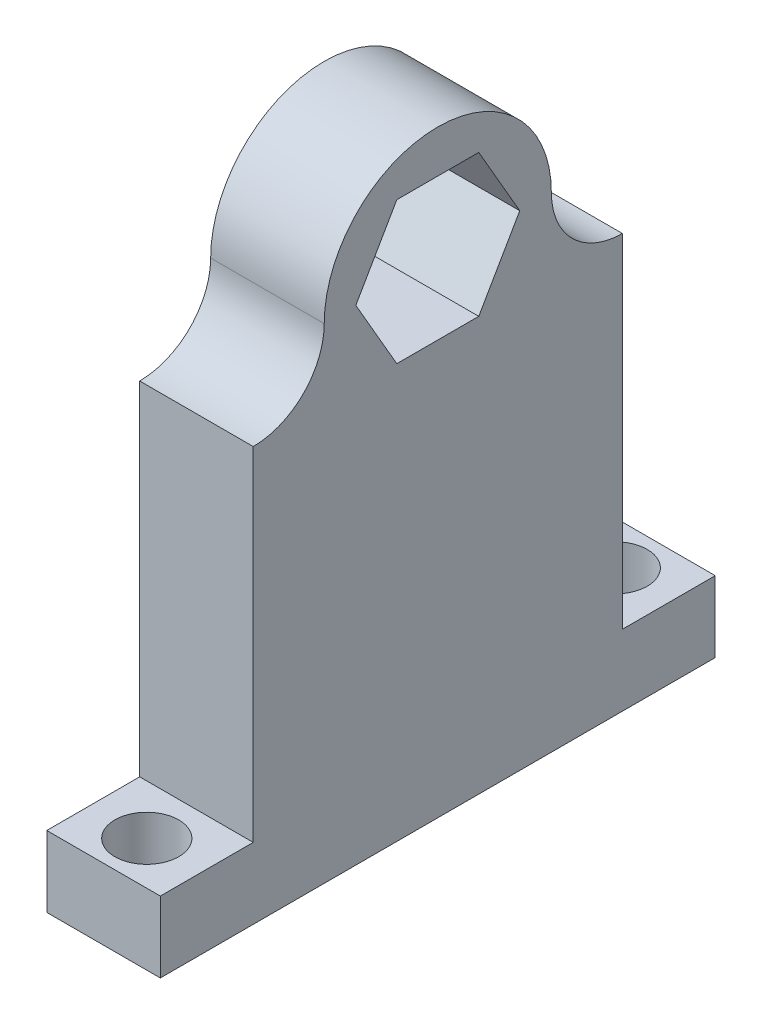
ISO-10303-21;
HEADER;
FILE_DESCRIPTION(('STEP AP214'),'2;1');
FILE_NAME('part.step','',(''),(''),'','','');
FILE_SCHEMA(('AUTOMOTIVE_DESIGN { 1 0 10303 214 1 1 1 1 }'));
ENDSEC;
DATA;
#1=APPLICATION_CONTEXT('core data for automotive mechanical design processes');
#2=APPLICATION_PROTOCOL_DEFINITION('international standard','automotive_design',2000,#1);
#3=PRODUCT_CONTEXT('',#1,'mechanical');
#4=PRODUCT('Part','Part','',(#3));
#5=PRODUCT_RELATED_PRODUCT_CATEGORY('part','',(#4));
#6=PRODUCT_DEFINITION_FORMATION('','',#4);
#7=PRODUCT_DEFINITION_CONTEXT('part definition',#1,'design');
#8=PRODUCT_DEFINITION('design','',#6,#7);
#9=PRODUCT_DEFINITION_SHAPE('','',#8);
#10=(LENGTH_UNIT() NAMED_UNIT(*) SI_UNIT(.MILLI.,.METRE.));
#11=(NAMED_UNIT(*) PLANE_ANGLE_UNIT() SI_UNIT($,.RADIAN.));
#12=(NAMED_UNIT(*) SI_UNIT($,.STERADIAN.) SOLID_ANGLE_UNIT());
#13=UNCERTAINTY_MEASURE_WITH_UNIT(LENGTH_MEASURE(1.E-05),#10,'distance_accuracy_value','');
#14=(GEOMETRIC_REPRESENTATION_CONTEXT(3) GLOBAL_UNCERTAINTY_ASSIGNED_CONTEXT((#13)) GLOBAL_UNIT_ASSIGNED_CONTEXT((#10,
#11,#12)) REPRESENTATION_CONTEXT('',''));
#15=CARTESIAN_POINT('',(0.,0.,0.));
#16=DIRECTION('',(0.,0.,1.));
#17=DIRECTION('',(1.,0.,0.));
#18=AXIS2_PLACEMENT_3D('',#15,#16,#17);
#19=CARTESIAN_POINT('',(8.,-5.,13.));
#20=DIRECTION('',(0.,0.,-1.));
#21=DIRECTION('',(0.,1.,0.));
#22=AXIS2_PLACEMENT_3D('',#19,#20,#21);
#23=PLANE('',#22);
#24=DIRECTION('',(-1.,0.,0.));
#25=VECTOR('',#24,1.);
#26=CARTESIAN_POINT('',(8.,-29.1500000000001,13.));
#27=LINE('',#26,#25);
#28=CARTESIAN_POINT('',(8.,-29.1500000000001,13.));
#29=VERTEX_POINT('',#28);
#30=CARTESIAN_POINT('',(0.,-29.1500000000001,13.));
#31=VERTEX_POINT('',#30);
#32=EDGE_CURVE('E62',#29,#31,#27,.T.);
#33=ORIENTED_EDGE('',*,*,#32,.F.);
#34=DIRECTION('',(0.,-1.,0.));
#35=VECTOR('',#34,1.);
#36=CARTESIAN_POINT('',(8.,-5.,13.));
#37=LINE('',#36,#35);
#38=CARTESIAN_POINT('',(8.,-5.00000000000003,13.));
#39=VERTEX_POINT('',#38);
#40=EDGE_CURVE('E263',#39,#29,#37,.T.);
#41=ORIENTED_EDGE('',*,*,#40,.F.);
#42=DIRECTION('',(-1.,0.,0.));
#43=VECTOR('',#42,1.);
#44=CARTESIAN_POINT('',(8.,-5.00000000000003,13.));
#45=LINE('',#44,#43);
#46=CARTESIAN_POINT('',(0.,-5.00000000000003,13.));
#47=VERTEX_POINT('',#46);
#48=EDGE_CURVE('E278',#39,#47,#45,.T.);
#49=ORIENTED_EDGE('',*,*,#48,.T.);
#50=DIRECTION('',(0.,-1.,0.));
#51=VECTOR('',#50,1.);
#52=CARTESIAN_POINT('',(0.,-5.,13.));
#53=LINE('',#52,#51);
#54=EDGE_CURVE('E273',#47,#31,#53,.T.);
#55=ORIENTED_EDGE('',*,*,#54,.T.);
#56=EDGE_LOOP('',(#33,#41,#49,#55));
#57=FACE_BOUND('',#56,.T.);
#58=ADVANCED_FACE('F39',(#57),#23,.F.);
#59=CARTESIAN_POINT('',(8.,-5.,-13.));
#60=DIRECTION('',(0.,0.,1.));
#61=DIRECTION('',(0.,-1.,0.));
#62=AXIS2_PLACEMENT_3D('',#59,#60,#61);
#63=PLANE('',#62);
#64=DIRECTION('',(1.,0.,0.));
#65=VECTOR('',#64,1.);
#66=CARTESIAN_POINT('',(8.,-29.15,-13.));
#67=LINE('',#66,#65);
#68=CARTESIAN_POINT('',(0.,-29.1500000000001,-13.));
#69=VERTEX_POINT('',#68);
#70=CARTESIAN_POINT('',(8.,-29.1500000000001,-13.));
#71=VERTEX_POINT('',#70);
#72=EDGE_CURVE('E196',#69,#71,#67,.T.);
#73=ORIENTED_EDGE('',*,*,#72,.F.);
#74=DIRECTION('',(0.,1.,0.));
#75=VECTOR('',#74,1.);
#76=CARTESIAN_POINT('',(0.,-5.,-13.));
#77=LINE('',#76,#75);
#78=CARTESIAN_POINT('',(0.,-5.,-13.));
#79=VERTEX_POINT('',#78);
#80=EDGE_CURVE('E161',#69,#79,#77,.T.);
#81=ORIENTED_EDGE('',*,*,#80,.T.);
#82=DIRECTION('',(-1.,0.,0.));
#83=VECTOR('',#82,1.);
#84=CARTESIAN_POINT('',(8.,-5.,-13.));
#85=LINE('',#84,#83);
#86=CARTESIAN_POINT('',(8.,-5.,-13.));
#87=VERTEX_POINT('',#86);
#88=EDGE_CURVE('E266',#87,#79,#85,.T.);
#89=ORIENTED_EDGE('',*,*,#88,.F.);
#90=DIRECTION('',(0.,1.,0.));
#91=VECTOR('',#90,1.);
#92=CARTESIAN_POINT('',(8.,-5.,-13.));
#93=LINE('',#92,#91);
#94=EDGE_CURVE('E54',#71,#87,#93,.T.);
#95=ORIENTED_EDGE('',*,*,#94,.F.);
#96=EDGE_LOOP('',(#73,#81,#89,#95));
#97=FACE_BOUND('',#96,.T.);
#98=ADVANCED_FACE('F306',(#97),#63,.F.);
#99=CARTESIAN_POINT('',(8.,0.,-13.));
#100=DIRECTION('',(-1.,0.,0.));
#101=DIRECTION('',(0.,0.,1.));
#102=AXIS2_PLACEMENT_3D('',#99,#100,#101);
#103=CYLINDRICAL_SURFACE('',#102,5.);
#104=CARTESIAN_POINT('',(0.,0.,-13.));
#105=DIRECTION('',(-1.,0.,0.));
#106=DIRECTION('',(0.,0.,-1.));
#107=AXIS2_PLACEMENT_3D('',#104,#105,#106);
#108=CIRCLE('',#107,5.);
#109=CARTESIAN_POINT('',(0.,0.,-8.));
#110=VERTEX_POINT('',#109);
#111=EDGE_CURVE('E245',#79,#110,#108,.T.);
#112=ORIENTED_EDGE('',*,*,#111,.T.);
#113=DIRECTION('',(-1.,0.,0.));
#114=VECTOR('',#113,1.);
#115=CARTESIAN_POINT('',(8.,0.,-8.));
#116=LINE('',#115,#114);
#117=CARTESIAN_POINT('',(8.,0.,-8.));
#118=VERTEX_POINT('',#117);
#119=EDGE_CURVE('E11',#118,#110,#116,.T.);
#120=ORIENTED_EDGE('',*,*,#119,.F.);
#121=CARTESIAN_POINT('',(8.,0.,-13.));
#122=DIRECTION('',(-1.,0.,0.));
#123=DIRECTION('',(0.,0.,-1.));
#124=AXIS2_PLACEMENT_3D('',#121,#122,#123);
#125=CIRCLE('',#124,5.);
#126=EDGE_CURVE('E256',#87,#118,#125,.T.);
#127=ORIENTED_EDGE('',*,*,#126,.F.);
#128=ORIENTED_EDGE('',*,*,#88,.T.);
#129=EDGE_LOOP('',(#112,#120,#127,#128));
#130=FACE_BOUND('',#129,.T.);
#131=ADVANCED_FACE('F41',(#130),#103,.F.);
#132=CARTESIAN_POINT('',(8.,0.,0.));
#133=DIRECTION('',(-1.,0.,0.));
#134=DIRECTION('',(0.,0.,1.));
#135=AXIS2_PLACEMENT_3D('',#132,#133,#134);
#136=CYLINDRICAL_SURFACE('',#135,8.);
#137=CARTESIAN_POINT('',(0.,0.,0.));
#138=DIRECTION('',(1.,0.,0.));
#139=DIRECTION('',(0.,0.,-1.));
#140=AXIS2_PLACEMENT_3D('',#137,#138,#139);
#141=CIRCLE('',#140,8.);
#142=CARTESIAN_POINT('',(0.,0.,8.));
#143=VERTEX_POINT('',#142);
#144=EDGE_CURVE('E269',#110,#143,#141,.T.);
#145=ORIENTED_EDGE('',*,*,#144,.T.);
#146=DIRECTION('',(-1.,0.,0.));
#147=VECTOR('',#146,1.);
#148=CARTESIAN_POINT('',(8.,0.,8.));
#149=LINE('',#148,#147);
#150=CARTESIAN_POINT('',(8.,0.,8.));
#151=VERTEX_POINT('',#150);
#152=EDGE_CURVE('E47',#151,#143,#149,.T.);
#153=ORIENTED_EDGE('',*,*,#152,.F.);
#154=CARTESIAN_POINT('',(8.,0.,0.));
#155=DIRECTION('',(1.,0.,0.));
#156=DIRECTION('',(0.,0.,-1.));
#157=AXIS2_PLACEMENT_3D('',#154,#155,#156);
#158=CIRCLE('',#157,8.);
#159=EDGE_CURVE('E259',#118,#151,#158,.T.);
#160=ORIENTED_EDGE('',*,*,#159,.F.);
#161=ORIENTED_EDGE('',*,*,#119,.T.);
#162=EDGE_LOOP('',(#145,#153,#160,#161));
#163=FACE_BOUND('',#162,.T.);
#164=ADVANCED_FACE('F308',(#163),#136,.T.);
#165=CARTESIAN_POINT('',(8.,0.,13.0000000000001));
#166=DIRECTION('',(-1.,0.,0.));
#167=DIRECTION('',(0.,0.,1.));
#168=AXIS2_PLACEMENT_3D('',#165,#166,#167);
#169=CYLINDRICAL_SURFACE('',#168,5.00000000000003);
#170=CARTESIAN_POINT('',(0.,0.,13.0000000000001));
#171=DIRECTION('',(-1.,0.,0.));
#172=DIRECTION('',(0.,0.,-1.));
#173=AXIS2_PLACEMENT_3D('',#170,#171,#172);
#174=CIRCLE('',#173,5.00000000000003);
#175=EDGE_CURVE('E271',#143,#47,#174,.T.);
#176=ORIENTED_EDGE('',*,*,#175,.T.);
#177=ORIENTED_EDGE('',*,*,#48,.F.);
#178=CARTESIAN_POINT('',(8.,0.,13.0000000000001));
#179=DIRECTION('',(-1.,0.,0.));
#180=DIRECTION('',(0.,0.,-1.));
#181=AXIS2_PLACEMENT_3D('',#178,#179,#180);
#182=CIRCLE('',#181,5.00000000000003);
#183=EDGE_CURVE('E261',#151,#39,#182,.T.);
#184=ORIENTED_EDGE('',*,*,#183,.F.);
#185=ORIENTED_EDGE('',*,*,#152,.T.);
#186=EDGE_LOOP('',(#176,#177,#184,#185));
#187=FACE_BOUND('',#186,.T.);
#188=ADVANCED_FACE('F285',(#187),#169,.F.);
#189=CARTESIAN_POINT('',(8.,0.,-13.));
#190=DIRECTION('',(1.,0.,0.));
#191=DIRECTION('',(0.,0.,-1.));
#192=AXIS2_PLACEMENT_3D('',#189,#190,#191);
#193=PLANE('',#192);
#194=DIRECTION('',(0.,0.,-1.));
#195=VECTOR('',#194,1.);
#196=CARTESIAN_POINT('',(8.,-34.1500000000001,-13.));
#197=LINE('',#196,#195);
#198=CARTESIAN_POINT('',(7.99999999999996,-34.1500000000001,19.5454545454058));
#199=VERTEX_POINT('',#198);
#200=CARTESIAN_POINT('',(7.99999999999996,-34.15,-19.5454545455033));
#201=VERTEX_POINT('',#200);
#202=EDGE_CURVE('E203',#199,#201,#197,.T.);
#203=ORIENTED_EDGE('',*,*,#202,.T.);
#204=DIRECTION('',(0.,-1.,0.));
#205=VECTOR('',#204,1.);
#206=CARTESIAN_POINT('',(7.99999999999996,-29.15,-19.5454545455033));
#207=LINE('',#206,#205);
#208=CARTESIAN_POINT('',(7.99999999999996,-29.15,-19.5454545455033));
#209=VERTEX_POINT('',#208);
#210=EDGE_CURVE('E174',#209,#201,#207,.T.);
#211=ORIENTED_EDGE('',*,*,#210,.F.);
#212=DIRECTION('',(0.,0.,1.));
#213=VECTOR('',#212,1.);
#214=CARTESIAN_POINT('',(7.99999999999996,-29.1500000000001,19.5454545454058));
#215=LINE('',#214,#213);
#216=EDGE_CURVE('E180',#209,#71,#215,.T.);
#217=ORIENTED_EDGE('',*,*,#216,.T.);
#218=ORIENTED_EDGE('',*,*,#94,.T.);
#219=ORIENTED_EDGE('',*,*,#126,.T.);
#220=ORIENTED_EDGE('',*,*,#159,.T.);
#221=ORIENTED_EDGE('',*,*,#183,.T.);
#222=ORIENTED_EDGE('',*,*,#40,.T.);
#223=CARTESIAN_POINT('',(7.99999999999996,-29.1500000000001,19.5454545454058));
#224=VERTEX_POINT('',#223);
#225=EDGE_CURVE('E181',#29,#224,#215,.T.);
#226=ORIENTED_EDGE('',*,*,#225,.T.);
#227=DIRECTION('',(0.,-1.,0.));
#228=VECTOR('',#227,1.);
#229=CARTESIAN_POINT('',(7.99999999999996,-29.1500000000001,19.5454545454058));
#230=LINE('',#229,#228);
#231=EDGE_CURVE('E197',#224,#199,#230,.T.);
#232=ORIENTED_EDGE('',*,*,#231,.T.);
#233=EDGE_LOOP('',(#203,#211,#217,#218,#219,#220,#221,#222,#226,#232));
#234=FACE_BOUND('',#233,.T.);
#235=DIRECTION('',(0.,0.866025403784439,-0.5));
#236=VECTOR('',#235,1.);
#237=CARTESIAN_POINT('',(8.,-5.,-2.88675134594813));
#238=LINE('',#237,#236);
#239=CARTESIAN_POINT('',(8.,-5.,-2.88675134594813));
#240=VERTEX_POINT('',#239);
#241=CARTESIAN_POINT('',(8.,0.,-5.77350269189626));
#242=VERTEX_POINT('',#241);
#243=EDGE_CURVE('E206',#240,#242,#238,.T.);
#244=ORIENTED_EDGE('',*,*,#243,.F.);
#245=DIRECTION('',(0.,0.,-1.));
#246=VECTOR('',#245,1.);
#247=CARTESIAN_POINT('',(8.,-5.,2.88675134594813));
#248=LINE('',#247,#246);
#249=CARTESIAN_POINT('',(8.,-5.,2.88675134594813));
#250=VERTEX_POINT('',#249);
#251=EDGE_CURVE('E212',#250,#240,#248,.T.);
#252=ORIENTED_EDGE('',*,*,#251,.F.);
#253=DIRECTION('',(0.,-0.866025403784439,-0.5));
#254=VECTOR('',#253,1.);
#255=CARTESIAN_POINT('',(8.,0.,5.77350269189626));
#256=LINE('',#255,#254);
#257=CARTESIAN_POINT('',(8.,0.,5.77350269189626));
#258=VERTEX_POINT('',#257);
#259=EDGE_CURVE('E238',#258,#250,#256,.T.);
#260=ORIENTED_EDGE('',*,*,#259,.F.);
#261=DIRECTION('',(0.,-0.866025403784439,0.5));
#262=VECTOR('',#261,1.);
#263=CARTESIAN_POINT('',(8.,5.,2.88675134594813));
#264=LINE('',#263,#262);
#265=CARTESIAN_POINT('',(8.,5.,2.88675134594813));
#266=VERTEX_POINT('',#265);
#267=EDGE_CURVE('E235',#266,#258,#264,.T.);
#268=ORIENTED_EDGE('',*,*,#267,.F.);
#269=DIRECTION('',(0.,0.,1.));
#270=VECTOR('',#269,1.);
#271=CARTESIAN_POINT('',(8.,5.,-2.88675134594813));
#272=LINE('',#271,#270);
#273=CARTESIAN_POINT('',(8.,5.,-2.88675134594813));
#274=VERTEX_POINT('',#273);
#275=EDGE_CURVE('E232',#274,#266,#272,.T.);
#276=ORIENTED_EDGE('',*,*,#275,.F.);
#277=DIRECTION('',(0.,0.866025403784439,0.5));
#278=VECTOR('',#277,1.);
#279=CARTESIAN_POINT('',(8.,0.,-5.77350269189626));
#280=LINE('',#279,#278);
#281=EDGE_CURVE('E229',#242,#274,#280,.T.);
#282=ORIENTED_EDGE('',*,*,#281,.F.);
#283=EDGE_LOOP('',(#244,#252,#260,#268,#276,#282));
#284=FACE_BOUND('',#283,.T.);
#285=ADVANCED_FACE('F296',(#234,#284),#193,.T.);
#286=CARTESIAN_POINT('',(0.,0.,-13.));
#287=DIRECTION('',(1.,0.,0.));
#288=DIRECTION('',(0.,0.,-1.));
#289=AXIS2_PLACEMENT_3D('',#286,#287,#288);
#290=PLANE('',#289);
#291=DIRECTION('',(0.,0.,1.));
#292=VECTOR('',#291,1.);
#293=CARTESIAN_POINT('',(0.,-34.15,13.));
#294=LINE('',#293,#292);
#295=CARTESIAN_POINT('',(0.,-34.15,-19.5454545455033));
#296=VERTEX_POINT('',#295);
#297=CARTESIAN_POINT('',(0.,-34.1500000000001,19.5454545454058));
#298=VERTEX_POINT('',#297);
#299=EDGE_CURVE('E204',#296,#298,#294,.T.);
#300=ORIENTED_EDGE('',*,*,#299,.T.);
#301=DIRECTION('',(0.,-1.,0.));
#302=VECTOR('',#301,1.);
#303=CARTESIAN_POINT('',(0.,-29.1500000000001,19.5454545454058));
#304=LINE('',#303,#302);
#305=CARTESIAN_POINT('',(0.,-29.1500000000001,19.5454545454058));
#306=VERTEX_POINT('',#305);
#307=EDGE_CURVE('E193',#306,#298,#304,.T.);
#308=ORIENTED_EDGE('',*,*,#307,.F.);
#309=DIRECTION('',(0.,0.,-1.));
#310=VECTOR('',#309,1.);
#311=CARTESIAN_POINT('',(0.,-29.1500000000001,19.5454545454058));
#312=LINE('',#311,#310);
#313=EDGE_CURVE('E164',#306,#31,#312,.T.);
#314=ORIENTED_EDGE('',*,*,#313,.T.);
#315=ORIENTED_EDGE('',*,*,#54,.F.);
#316=ORIENTED_EDGE('',*,*,#175,.F.);
#317=ORIENTED_EDGE('',*,*,#144,.F.);
#318=ORIENTED_EDGE('',*,*,#111,.F.);
#319=ORIENTED_EDGE('',*,*,#80,.F.);
#320=CARTESIAN_POINT('',(0.,-29.15,-19.5454545455033));
#321=VERTEX_POINT('',#320);
#322=EDGE_CURVE('E154',#69,#321,#312,.T.);
#323=ORIENTED_EDGE('',*,*,#322,.T.);
#324=DIRECTION('',(0.,-1.,0.));
#325=VECTOR('',#324,1.);
#326=CARTESIAN_POINT('',(0.,-29.15,-19.5454545455033));
#327=LINE('',#326,#325);
#328=EDGE_CURVE('E158',#321,#296,#327,.T.);
#329=ORIENTED_EDGE('',*,*,#328,.T.);
#330=EDGE_LOOP('',(#300,#308,#314,#315,#316,#317,#318,#319,#323,#329));
#331=FACE_BOUND('',#330,.T.);
#332=DIRECTION('',(0.,0.,-1.));
#333=VECTOR('',#332,1.);
#334=CARTESIAN_POINT('',(0.,-5.,2.88675134594813));
#335=LINE('',#334,#333);
#336=CARTESIAN_POINT('',(0.,-5.,2.88675134594813));
#337=VERTEX_POINT('',#336);
#338=CARTESIAN_POINT('',(0.,-5.,-2.88675134594813));
#339=VERTEX_POINT('',#338);
#340=EDGE_CURVE('E224',#337,#339,#335,.T.);
#341=ORIENTED_EDGE('',*,*,#340,.T.);
#342=DIRECTION('',(0.,0.866025403784439,-0.5));
#343=VECTOR('',#342,1.);
#344=CARTESIAN_POINT('',(0.,-5.,-2.88675134594813));
#345=LINE('',#344,#343);
#346=CARTESIAN_POINT('',(0.,0.,-5.77350269189626));
#347=VERTEX_POINT('',#346);
#348=EDGE_CURVE('E208',#339,#347,#345,.T.);
#349=ORIENTED_EDGE('',*,*,#348,.T.);
#350=DIRECTION('',(0.,0.866025403784439,0.5));
#351=VECTOR('',#350,1.);
#352=CARTESIAN_POINT('',(0.,0.,-5.77350269189626));
#353=LINE('',#352,#351);
#354=CARTESIAN_POINT('',(0.,5.,-2.88675134594813));
#355=VERTEX_POINT('',#354);
#356=EDGE_CURVE('E211',#347,#355,#353,.T.);
#357=ORIENTED_EDGE('',*,*,#356,.T.);
#358=DIRECTION('',(0.,0.,1.));
#359=VECTOR('',#358,1.);
#360=CARTESIAN_POINT('',(0.,5.,-2.88675134594813));
#361=LINE('',#360,#359);
#362=CARTESIAN_POINT('',(0.,5.,2.88675134594813));
#363=VERTEX_POINT('',#362);
#364=EDGE_CURVE('E215',#355,#363,#361,.T.);
#365=ORIENTED_EDGE('',*,*,#364,.T.);
#366=DIRECTION('',(0.,-0.866025403784439,0.5));
#367=VECTOR('',#366,1.);
#368=CARTESIAN_POINT('',(0.,5.,2.88675134594813));
#369=LINE('',#368,#367);
#370=CARTESIAN_POINT('',(0.,0.,5.77350269189626));
#371=VERTEX_POINT('',#370);
#372=EDGE_CURVE('E218',#363,#371,#369,.T.);
#373=ORIENTED_EDGE('',*,*,#372,.T.);
#374=DIRECTION('',(0.,-0.866025403784439,-0.5));
#375=VECTOR('',#374,1.);
#376=CARTESIAN_POINT('',(0.,0.,5.77350269189626));
#377=LINE('',#376,#375);
#378=EDGE_CURVE('E221',#371,#337,#377,.T.);
#379=ORIENTED_EDGE('',*,*,#378,.T.);
#380=EDGE_LOOP('',(#341,#349,#357,#365,#373,#379));
#381=FACE_BOUND('',#380,.T.);
#382=ADVANCED_FACE('F156',(#331,#381),#290,.F.);
#383=CARTESIAN_POINT('',(0.,-5.,-2.88675134594813));
#384=DIRECTION('',(0.,-0.5,-0.866025403784439));
#385=DIRECTION('',(0.,0.866025403784439,-0.5));
#386=AXIS2_PLACEMENT_3D('',#383,#384,#385);
#387=PLANE('',#386);
#388=ORIENTED_EDGE('',*,*,#243,.T.);
#389=DIRECTION('',(1.,0.,0.));
#390=VECTOR('',#389,1.);
#391=CARTESIAN_POINT('',(0.,0.,-5.77350269189626));
#392=LINE('',#391,#390);
#393=EDGE_CURVE('E227',#347,#242,#392,.T.);
#394=ORIENTED_EDGE('',*,*,#393,.F.);
#395=ORIENTED_EDGE('',*,*,#348,.F.);
#396=DIRECTION('',(1.,0.,0.));
#397=VECTOR('',#396,1.);
#398=CARTESIAN_POINT('',(0.,-5.,-2.88675134594813));
#399=LINE('',#398,#397);
#400=EDGE_CURVE('E243',#339,#240,#399,.T.);
#401=ORIENTED_EDGE('',*,*,#400,.T.);
#402=EDGE_LOOP('',(#388,#394,#395,#401));
#403=FACE_BOUND('',#402,.T.);
#404=ADVANCED_FACE('F325',(#403),#387,.F.);
#405=CARTESIAN_POINT('',(0.,-5.,2.88675134594813));
#406=DIRECTION('',(0.,-1.,0.));
#407=DIRECTION('',(0.,0.,-1.));
#408=AXIS2_PLACEMENT_3D('',#405,#406,#407);
#409=PLANE('',#408);
#410=ORIENTED_EDGE('',*,*,#251,.T.);
#411=ORIENTED_EDGE('',*,*,#400,.F.);
#412=ORIENTED_EDGE('',*,*,#340,.F.);
#413=DIRECTION('',(1.,0.,0.));
#414=VECTOR('',#413,1.);
#415=CARTESIAN_POINT('',(0.,-5.,2.88675134594813));
#416=LINE('',#415,#414);
#417=EDGE_CURVE('E246',#337,#250,#416,.T.);
#418=ORIENTED_EDGE('',*,*,#417,.T.);
#419=EDGE_LOOP('',(#410,#411,#412,#418));
#420=FACE_BOUND('',#419,.T.);
#421=ADVANCED_FACE('F330',(#420),#409,.F.);
#422=CARTESIAN_POINT('',(0.,0.,5.77350269189626));
#423=DIRECTION('',(0.,-0.5,0.866025403784439));
#424=DIRECTION('',(0.,-0.866025403784439,-0.5));
#425=AXIS2_PLACEMENT_3D('',#422,#423,#424);
#426=PLANE('',#425);
#427=ORIENTED_EDGE('',*,*,#259,.T.);
#428=ORIENTED_EDGE('',*,*,#417,.F.);
#429=ORIENTED_EDGE('',*,*,#378,.F.);
#430=DIRECTION('',(1.,0.,0.));
#431=VECTOR('',#430,1.);
#432=CARTESIAN_POINT('',(0.,0.,5.77350269189626));
#433=LINE('',#432,#431);
#434=EDGE_CURVE('E248',#371,#258,#433,.T.);
#435=ORIENTED_EDGE('',*,*,#434,.T.);
#436=EDGE_LOOP('',(#427,#428,#429,#435));
#437=FACE_BOUND('',#436,.T.);
#438=ADVANCED_FACE('F342',(#437),#426,.F.);
#439=CARTESIAN_POINT('',(0.,5.,2.88675134594813));
#440=DIRECTION('',(0.,0.5,0.866025403784439));
#441=DIRECTION('',(0.,-0.866025403784439,0.5));
#442=AXIS2_PLACEMENT_3D('',#439,#440,#441);
#443=PLANE('',#442);
#444=ORIENTED_EDGE('',*,*,#267,.T.);
#445=ORIENTED_EDGE('',*,*,#434,.F.);
#446=ORIENTED_EDGE('',*,*,#372,.F.);
#447=DIRECTION('',(1.,0.,0.));
#448=VECTOR('',#447,1.);
#449=CARTESIAN_POINT('',(0.,5.,2.88675134594813));
#450=LINE('',#449,#448);
#451=EDGE_CURVE('E250',#363,#266,#450,.T.);
#452=ORIENTED_EDGE('',*,*,#451,.T.);
#453=EDGE_LOOP('',(#444,#445,#446,#452));
#454=FACE_BOUND('',#453,.T.);
#455=ADVANCED_FACE('F338',(#454),#443,.F.);
#456=CARTESIAN_POINT('',(0.,5.,-2.88675134594813));
#457=DIRECTION('',(0.,1.,0.));
#458=DIRECTION('',(0.,0.,1.));
#459=AXIS2_PLACEMENT_3D('',#456,#457,#458);
#460=PLANE('',#459);
#461=ORIENTED_EDGE('',*,*,#275,.T.);
#462=ORIENTED_EDGE('',*,*,#451,.F.);
#463=ORIENTED_EDGE('',*,*,#364,.F.);
#464=DIRECTION('',(1.,0.,0.));
#465=VECTOR('',#464,1.);
#466=CARTESIAN_POINT('',(0.,5.,-2.88675134594813));
#467=LINE('',#466,#465);
#468=EDGE_CURVE('E252',#355,#274,#467,.T.);
#469=ORIENTED_EDGE('',*,*,#468,.T.);
#470=EDGE_LOOP('',(#461,#462,#463,#469));
#471=FACE_BOUND('',#470,.T.);
#472=ADVANCED_FACE('F334',(#471),#460,.F.);
#473=CARTESIAN_POINT('',(0.,0.,-5.77350269189626));
#474=DIRECTION('',(0.,0.5,-0.866025403784439));
#475=DIRECTION('',(0.,0.866025403784439,0.5));
#476=AXIS2_PLACEMENT_3D('',#473,#474,#475);
#477=PLANE('',#476);
#478=ORIENTED_EDGE('',*,*,#281,.T.);
#479=ORIENTED_EDGE('',*,*,#468,.F.);
#480=ORIENTED_EDGE('',*,*,#356,.F.);
#481=ORIENTED_EDGE('',*,*,#393,.T.);
#482=EDGE_LOOP('',(#478,#479,#480,#481));
#483=FACE_BOUND('',#482,.T.);
#484=ADVANCED_FACE('F332',(#483),#477,.F.);
#485=CARTESIAN_POINT('',(-35.9999999999445,-34.15,-91.0000000000138));
#486=DIRECTION('',(0.,1.,0.));
#487=DIRECTION('',(-0.0146423992971153,0.,0.999892794324884));
#488=AXIS2_PLACEMENT_3D('',#485,#486,#487);
#489=PLANE('',#488);
#490=ORIENTED_EDGE('',*,*,#299,.F.);
#491=DIRECTION('',(1.,0.,0.));
#492=VECTOR('',#491,1.);
#493=CARTESIAN_POINT('',(0.,-34.15,-19.5454545455033));
#494=LINE('',#493,#492);
#495=EDGE_CURVE('E173',#296,#201,#494,.T.);
#496=ORIENTED_EDGE('',*,*,#495,.T.);
#497=ORIENTED_EDGE('',*,*,#202,.F.);
#498=DIRECTION('',(-1.,0.,0.));
#499=VECTOR('',#498,1.);
#500=CARTESIAN_POINT('',(0.,-34.1500000000001,19.5454545454058));
#501=LINE('',#500,#499);
#502=EDGE_CURVE('E165',#199,#298,#501,.T.);
#503=ORIENTED_EDGE('',*,*,#502,.T.);
#504=EDGE_LOOP('',(#490,#496,#497,#503));
#505=FACE_BOUND('',#504,.T.);
#506=CARTESIAN_POINT('',(3.99999999999996,-34.15,-16.5000000000487));
#507=DIRECTION('',(0.,-1.,0.));
#508=DIRECTION('',(0.,0.,-1.));
#509=AXIS2_PLACEMENT_3D('',#506,#507,#508);
#510=CIRCLE('',#509,2.25000000001165);
#511=CARTESIAN_POINT('',(3.99999999999996,-34.15,-18.7500000000604));
#512=VERTEX_POINT('',#511);
#513=EDGE_CURVE('E377',#512,#512,#510,.T.);
#514=ORIENTED_EDGE('',*,*,#513,.F.);
#515=EDGE_LOOP('',(#514));
#516=FACE_BOUND('',#515,.T.);
#517=CARTESIAN_POINT('',(3.99999999999996,-34.1500000000001,16.4999999999513));
#518=DIRECTION('',(0.,-1.,0.));
#519=DIRECTION('',(0.,0.,-1.));
#520=AXIS2_PLACEMENT_3D('',#517,#518,#519);
#521=CIRCLE('',#520,2.25000000001165);
#522=CARTESIAN_POINT('',(3.99999999999996,-34.1500000000001,14.2499999999396));
#523=VERTEX_POINT('',#522);
#524=EDGE_CURVE('E374',#523,#523,#521,.T.);
#525=ORIENTED_EDGE('',*,*,#524,.F.);
#526=EDGE_LOOP('',(#525));
#527=FACE_BOUND('',#526,.T.);
#528=ADVANCED_FACE('F302',(#505,#516,#527),#489,.F.);
#529=CARTESIAN_POINT('',(0.,-29.15,-19.5454545455033));
#530=DIRECTION('',(0.,0.,-1.));
#531=DIRECTION('',(0.,1.,0.));
#532=AXIS2_PLACEMENT_3D('',#529,#530,#531);
#533=PLANE('',#532);
#534=ORIENTED_EDGE('',*,*,#495,.F.);
#535=ORIENTED_EDGE('',*,*,#328,.F.);
#536=DIRECTION('',(1.,0.,0.));
#537=VECTOR('',#536,1.);
#538=CARTESIAN_POINT('',(0.,-29.15,-19.5454545455033));
#539=LINE('',#538,#537);
#540=EDGE_CURVE('E171',#321,#209,#539,.T.);
#541=ORIENTED_EDGE('',*,*,#540,.T.);
#542=ORIENTED_EDGE('',*,*,#210,.T.);
#543=EDGE_LOOP('',(#534,#535,#541,#542));
#544=FACE_BOUND('',#543,.T.);
#545=ADVANCED_FACE('F169',(#544),#533,.T.);
#546=CARTESIAN_POINT('',(3.99999999999996,-29.15,-16.5000000000487));
#547=DIRECTION('',(0.,-1.,0.));
#548=DIRECTION('',(0.,0.,-1.));
#549=AXIS2_PLACEMENT_3D('',#546,#547,#548);
#550=CYLINDRICAL_SURFACE('',#549,2.25000000001165);
#551=CARTESIAN_POINT('',(3.99999999999996,-29.15,-16.5000000000487));
#552=DIRECTION('',(0.,-1.,0.));
#553=DIRECTION('',(0.,0.,-1.));
#554=AXIS2_PLACEMENT_3D('',#551,#552,#553);
#555=CIRCLE('',#554,2.25000000001165);
#556=CARTESIAN_POINT('',(3.99999999999996,-29.15,-18.7500000000604));
#557=VERTEX_POINT('',#556);
#558=EDGE_CURVE('E190',#557,#557,#555,.T.);
#559=ORIENTED_EDGE('',*,*,#558,.F.);
#560=EDGE_LOOP('',(#559));
#561=FACE_BOUND('',#560,.T.);
#562=ORIENTED_EDGE('',*,*,#513,.T.);
#563=EDGE_LOOP('',(#562));
#564=FACE_BOUND('',#563,.T.);
#565=ADVANCED_FACE('F354',(#561,#564),#550,.F.);
#566=CARTESIAN_POINT('',(0.,-29.15,0.));
#567=DIRECTION('',(0.,-1.,0.));
#568=DIRECTION('',(0.,0.,-1.));
#569=AXIS2_PLACEMENT_3D('',#566,#567,#568);
#570=PLANE('',#569);
#571=ORIENTED_EDGE('',*,*,#558,.T.);
#572=EDGE_LOOP('',(#571));
#573=FACE_BOUND('',#572,.T.);
#574=ORIENTED_EDGE('',*,*,#322,.F.);
#575=ORIENTED_EDGE('',*,*,#72,.T.);
#576=ORIENTED_EDGE('',*,*,#216,.F.);
#577=ORIENTED_EDGE('',*,*,#540,.F.);
#578=EDGE_LOOP('',(#574,#575,#576,#577));
#579=FACE_BOUND('',#578,.T.);
#580=ADVANCED_FACE('F178',(#573,#579),#570,.F.);
#581=CARTESIAN_POINT('',(3.99999999999996,-29.1500000000001,16.4999999999513));
#582=DIRECTION('',(0.,-1.,0.));
#583=DIRECTION('',(0.,0.,-1.));
#584=AXIS2_PLACEMENT_3D('',#581,#582,#583);
#585=CIRCLE('',#584,2.25000000001165);
#586=CARTESIAN_POINT('',(3.99999999999996,-29.1500000000001,14.2499999999396));
#587=VERTEX_POINT('',#586);
#588=EDGE_CURVE('E371',#587,#587,#585,.T.);
#589=ORIENTED_EDGE('',*,*,#588,.T.);
#590=EDGE_LOOP('',(#589));
#591=FACE_BOUND('',#590,.T.);
#592=ORIENTED_EDGE('',*,*,#225,.F.);
#593=ORIENTED_EDGE('',*,*,#32,.T.);
#594=ORIENTED_EDGE('',*,*,#313,.F.);
#595=DIRECTION('',(-1.,0.,0.));
#596=VECTOR('',#595,1.);
#597=CARTESIAN_POINT('',(0.,-29.1500000000001,19.5454545454058));
#598=LINE('',#597,#596);
#599=EDGE_CURVE('E175',#224,#306,#598,.T.);
#600=ORIENTED_EDGE('',*,*,#599,.F.);
#601=EDGE_LOOP('',(#592,#593,#594,#600));
#602=FACE_BOUND('',#601,.T.);
#603=ADVANCED_FACE('F292',(#591,#602),#570,.F.);
#604=CARTESIAN_POINT('',(0.,-29.1500000000001,19.5454545454058));
#605=DIRECTION('',(0.,0.,1.));
#606=DIRECTION('',(0.,-1.,0.));
#607=AXIS2_PLACEMENT_3D('',#604,#605,#606);
#608=PLANE('',#607);
#609=ORIENTED_EDGE('',*,*,#502,.F.);
#610=ORIENTED_EDGE('',*,*,#231,.F.);
#611=ORIENTED_EDGE('',*,*,#599,.T.);
#612=ORIENTED_EDGE('',*,*,#307,.T.);
#613=EDGE_LOOP('',(#609,#610,#611,#612));
#614=FACE_BOUND('',#613,.T.);
#615=ADVANCED_FACE('F300',(#614),#608,.T.);
#616=CARTESIAN_POINT('',(3.99999999999996,-29.1500000000001,16.4999999999513));
#617=DIRECTION('',(0.,-1.,0.));
#618=DIRECTION('',(0.,0.,-1.));
#619=AXIS2_PLACEMENT_3D('',#616,#617,#618);
#620=CYLINDRICAL_SURFACE('',#619,2.25000000001165);
#621=ORIENTED_EDGE('',*,*,#588,.F.);
#622=EDGE_LOOP('',(#621));
#623=FACE_BOUND('',#622,.T.);
#624=ORIENTED_EDGE('',*,*,#524,.T.);
#625=EDGE_LOOP('',(#624));
#626=FACE_BOUND('',#625,.T.);
#627=ADVANCED_FACE('F357',(#623,#626),#620,.F.);
#628=CLOSED_SHELL('',(#58,#98,#131,#164,#188,#285,#382,#404,#421,#438,#455,#472,#484,#528,#545,
#565,#580,#603,#615,#627));
#629=MANIFOLD_SOLID_BREP('B2',#628);
#630=ADVANCED_BREP_SHAPE_REPRESENTATION('',(#18,#629),#14);
#631=SHAPE_DEFINITION_REPRESENTATION(#9,#630);
ENDSEC;
END-ISO-10303-21;
